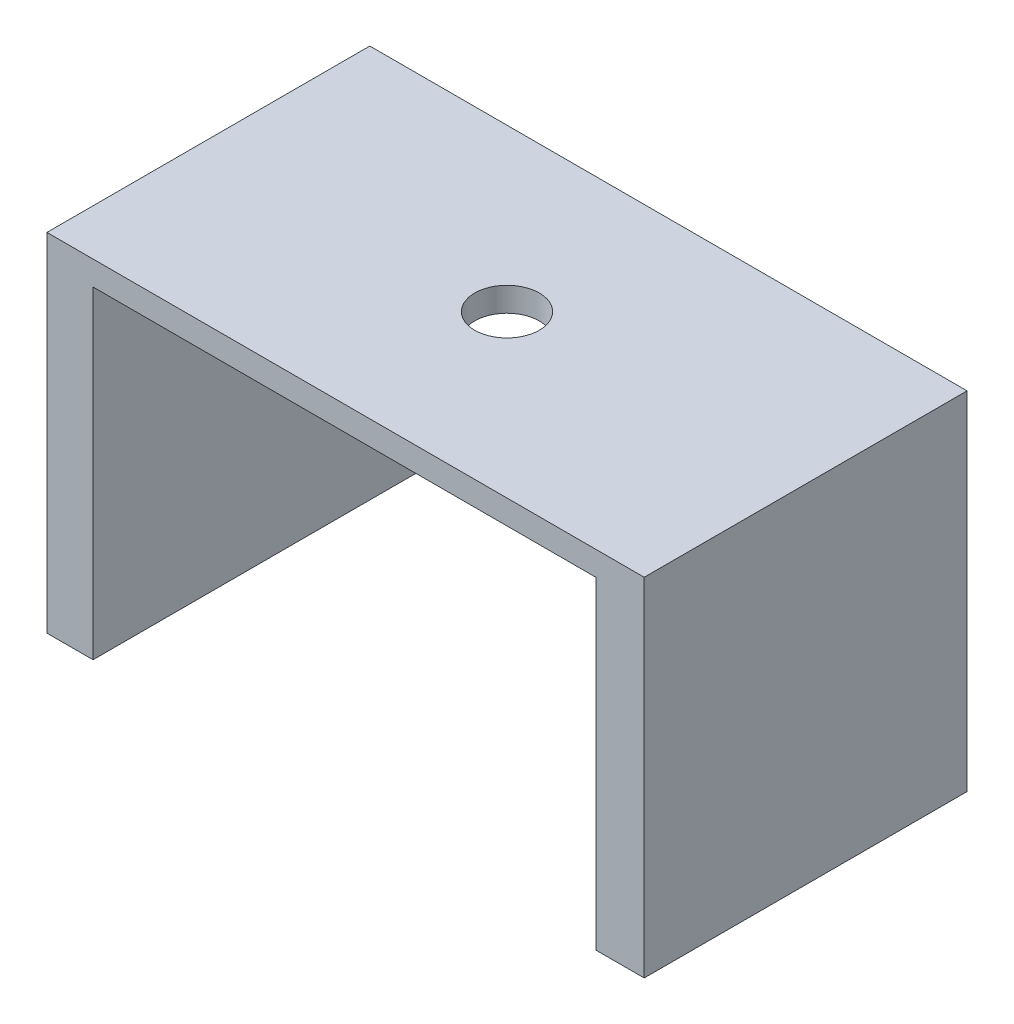
ISO-10303-21;
HEADER;
FILE_DESCRIPTION(('STEP AP214'),'2;1');
FILE_NAME('part.step','',(''),(''),'','','');
FILE_SCHEMA(('AUTOMOTIVE_DESIGN { 1 0 10303 214 1 1 1 1 }'));
ENDSEC;
DATA;
#1=APPLICATION_CONTEXT('core data for automotive mechanical design processes');
#2=APPLICATION_PROTOCOL_DEFINITION('international standard','automotive_design',2000,#1);
#3=PRODUCT_CONTEXT('',#1,'mechanical');
#4=PRODUCT('Part','Part','',(#3));
#5=PRODUCT_RELATED_PRODUCT_CATEGORY('part','',(#4));
#6=PRODUCT_DEFINITION_FORMATION('','',#4);
#7=PRODUCT_DEFINITION_CONTEXT('part definition',#1,'design');
#8=PRODUCT_DEFINITION('design','',#6,#7);
#9=PRODUCT_DEFINITION_SHAPE('','',#8);
#10=(LENGTH_UNIT() NAMED_UNIT(*) SI_UNIT(.MILLI.,.METRE.));
#11=(NAMED_UNIT(*) PLANE_ANGLE_UNIT() SI_UNIT($,.RADIAN.));
#12=(NAMED_UNIT(*) SI_UNIT($,.STERADIAN.) SOLID_ANGLE_UNIT());
#13=UNCERTAINTY_MEASURE_WITH_UNIT(LENGTH_MEASURE(1.E-05),#10,'distance_accuracy_value','');
#14=(GEOMETRIC_REPRESENTATION_CONTEXT(3) GLOBAL_UNCERTAINTY_ASSIGNED_CONTEXT((#13)) GLOBAL_UNIT_ASSIGNED_CONTEXT((#10,
#11,#12)) REPRESENTATION_CONTEXT('',''));
#15=CARTESIAN_POINT('',(0.,0.,0.));
#16=DIRECTION('',(0.,0.,1.));
#17=DIRECTION('',(1.,0.,0.));
#18=AXIS2_PLACEMENT_3D('',#15,#16,#17);
#19=CARTESIAN_POINT('',(0.,0.,0.));
#20=DIRECTION('',(0.,1.,0.));
#21=DIRECTION('',(0.,0.,1.));
#22=AXIS2_PLACEMENT_3D('',#19,#20,#21);
#23=PLANE('',#22);
#24=CARTESIAN_POINT('',(0.,0.,0.));
#25=DIRECTION('',(0.,1.,0.));
#26=DIRECTION('',(0.,0.,1.));
#27=AXIS2_PLACEMENT_3D('',#24,#25,#26);
#28=CIRCLE('',#27,20.);
#29=CARTESIAN_POINT('',(0.,0.,20.));
#30=VERTEX_POINT('',#29);
#31=EDGE_CURVE('E138',#30,#30,#28,.T.);
#32=ORIENTED_EDGE('',*,*,#31,.T.);
#33=EDGE_LOOP('',(#32));
#34=FACE_BOUND('',#33,.T.);
#35=DIRECTION('',(0.,0.,1.));
#36=VECTOR('',#35,1.);
#37=CARTESIAN_POINT('',(-156.43830766609,0.,100.));
#38=LINE('',#37,#36);
#39=CARTESIAN_POINT('',(-156.43830766609,0.,-100.));
#40=VERTEX_POINT('',#39);
#41=CARTESIAN_POINT('',(-156.43830766609,0.,100.));
#42=VERTEX_POINT('',#41);
#43=EDGE_CURVE('E61',#40,#42,#38,.T.);
#44=ORIENTED_EDGE('',*,*,#43,.F.);
#45=DIRECTION('',(-1.,0.,0.));
#46=VECTOR('',#45,1.);
#47=CARTESIAN_POINT('',(-185.,0.,-100.));
#48=LINE('',#47,#46);
#49=CARTESIAN_POINT('',(155.,0.,-100.));
#50=VERTEX_POINT('',#49);
#51=EDGE_CURVE('E151',#50,#40,#48,.T.);
#52=ORIENTED_EDGE('',*,*,#51,.F.);
#53=DIRECTION('',(0.,0.,-1.));
#54=VECTOR('',#53,1.);
#55=CARTESIAN_POINT('',(155.,0.,100.));
#56=LINE('',#55,#54);
#57=CARTESIAN_POINT('',(155.,0.,100.));
#58=VERTEX_POINT('',#57);
#59=EDGE_CURVE('E66',#58,#50,#56,.T.);
#60=ORIENTED_EDGE('',*,*,#59,.F.);
#61=DIRECTION('',(1.,0.,0.));
#62=VECTOR('',#61,1.);
#63=CARTESIAN_POINT('',(-185.,0.,100.));
#64=LINE('',#63,#62);
#65=EDGE_CURVE('E181',#42,#58,#64,.T.);
#66=ORIENTED_EDGE('',*,*,#65,.F.);
#67=EDGE_LOOP('',(#44,#52,#60,#66));
#68=FACE_BOUND('',#67,.T.);
#69=ADVANCED_FACE('F45',(#34,#68),#23,.F.);
#70=CARTESIAN_POINT('',(185.,15.,-100.));
#71=DIRECTION('',(-1.,0.,0.));
#72=DIRECTION('',(0.,0.,1.));
#73=AXIS2_PLACEMENT_3D('',#70,#71,#72);
#74=PLANE('',#73);
#75=DIRECTION('',(0.,-1.,0.));
#76=VECTOR('',#75,1.);
#77=CARTESIAN_POINT('',(185.,15.,100.));
#78=LINE('',#77,#76);
#79=CARTESIAN_POINT('',(185.,15.,100.));
#80=VERTEX_POINT('',#79);
#81=CARTESIAN_POINT('',(185.,-200.,100.));
#82=VERTEX_POINT('',#81);
#83=EDGE_CURVE('E189',#80,#82,#78,.T.);
#84=ORIENTED_EDGE('',*,*,#83,.T.);
#85=DIRECTION('',(0.,0.,1.));
#86=VECTOR('',#85,1.);
#87=CARTESIAN_POINT('',(185.,-200.,100.));
#88=LINE('',#87,#86);
#89=CARTESIAN_POINT('',(185.,-200.,-100.));
#90=VERTEX_POINT('',#89);
#91=EDGE_CURVE('E163',#90,#82,#88,.T.);
#92=ORIENTED_EDGE('',*,*,#91,.F.);
#93=DIRECTION('',(0.,-1.,0.));
#94=VECTOR('',#93,1.);
#95=CARTESIAN_POINT('',(185.,15.,-100.));
#96=LINE('',#95,#94);
#97=CARTESIAN_POINT('',(185.,15.,-100.));
#98=VERTEX_POINT('',#97);
#99=EDGE_CURVE('E11',#98,#90,#96,.T.);
#100=ORIENTED_EDGE('',*,*,#99,.F.);
#101=DIRECTION('',(0.,0.,-1.));
#102=VECTOR('',#101,1.);
#103=CARTESIAN_POINT('',(185.,15.,-100.));
#104=LINE('',#103,#102);
#105=EDGE_CURVE('E176',#80,#98,#104,.T.);
#106=ORIENTED_EDGE('',*,*,#105,.F.);
#107=EDGE_LOOP('',(#84,#92,#100,#106));
#108=FACE_BOUND('',#107,.T.);
#109=ADVANCED_FACE('F47',(#108),#74,.F.);
#110=CARTESIAN_POINT('',(-185.,15.,-100.));
#111=DIRECTION('',(0.,0.,1.));
#112=DIRECTION('',(1.,0.,0.));
#113=AXIS2_PLACEMENT_3D('',#110,#111,#112);
#114=PLANE('',#113);
#115=ORIENTED_EDGE('',*,*,#99,.T.);
#116=DIRECTION('',(1.,0.,0.));
#117=VECTOR('',#116,1.);
#118=CARTESIAN_POINT('',(185.,-200.,-100.));
#119=LINE('',#118,#117);
#120=CARTESIAN_POINT('',(155.,-200.,-100.));
#121=VERTEX_POINT('',#120);
#122=EDGE_CURVE('E160',#121,#90,#119,.T.);
#123=ORIENTED_EDGE('',*,*,#122,.F.);
#124=DIRECTION('',(0.,1.,0.));
#125=VECTOR('',#124,1.);
#126=CARTESIAN_POINT('',(155.,-200.,-100.));
#127=LINE('',#126,#125);
#128=EDGE_CURVE('E156',#121,#50,#127,.T.);
#129=ORIENTED_EDGE('',*,*,#128,.T.);
#130=ORIENTED_EDGE('',*,*,#51,.T.);
#131=DIRECTION('',(0.,1.,0.));
#132=VECTOR('',#131,1.);
#133=CARTESIAN_POINT('',(-156.43830766609,-200.,-100.));
#134=LINE('',#133,#132);
#135=CARTESIAN_POINT('',(-156.43830766609,-200.,-100.));
#136=VERTEX_POINT('',#135);
#137=EDGE_CURVE('E123',#136,#40,#134,.T.);
#138=ORIENTED_EDGE('',*,*,#137,.F.);
#139=DIRECTION('',(1.,0.,0.));
#140=VECTOR('',#139,1.);
#141=CARTESIAN_POINT('',(-185.,-200.,-100.));
#142=LINE('',#141,#140);
#143=CARTESIAN_POINT('',(-185.,-200.,-100.));
#144=VERTEX_POINT('',#143);
#145=EDGE_CURVE('E120',#144,#136,#142,.T.);
#146=ORIENTED_EDGE('',*,*,#145,.F.);
#147=DIRECTION('',(0.,-1.,0.));
#148=VECTOR('',#147,1.);
#149=CARTESIAN_POINT('',(-185.,15.,-100.));
#150=LINE('',#149,#148);
#151=CARTESIAN_POINT('',(-185.,15.,-100.));
#152=VERTEX_POINT('',#151);
#153=EDGE_CURVE('E54',#152,#144,#150,.T.);
#154=ORIENTED_EDGE('',*,*,#153,.F.);
#155=DIRECTION('',(-1.,0.,0.));
#156=VECTOR('',#155,1.);
#157=CARTESIAN_POINT('',(-185.,15.,-100.));
#158=LINE('',#157,#156);
#159=EDGE_CURVE('E180',#98,#152,#158,.T.);
#160=ORIENTED_EDGE('',*,*,#159,.F.);
#161=EDGE_LOOP('',(#115,#123,#129,#130,#138,#146,#154,#160));
#162=FACE_BOUND('',#161,.T.);
#163=ADVANCED_FACE('F121',(#162),#114,.F.);
#164=CARTESIAN_POINT('',(-185.,15.,-100.));
#165=DIRECTION('',(1.,0.,0.));
#166=DIRECTION('',(0.,0.,-1.));
#167=AXIS2_PLACEMENT_3D('',#164,#165,#166);
#168=PLANE('',#167);
#169=ORIENTED_EDGE('',*,*,#153,.T.);
#170=DIRECTION('',(0.,0.,-1.));
#171=VECTOR('',#170,1.);
#172=CARTESIAN_POINT('',(-185.,-200.,100.));
#173=LINE('',#172,#171);
#174=CARTESIAN_POINT('',(-185.,-200.,100.));
#175=VERTEX_POINT('',#174);
#176=EDGE_CURVE('E114',#175,#144,#173,.T.);
#177=ORIENTED_EDGE('',*,*,#176,.F.);
#178=DIRECTION('',(0.,-1.,0.));
#179=VECTOR('',#178,1.);
#180=CARTESIAN_POINT('',(-185.,15.,100.));
#181=LINE('',#180,#179);
#182=CARTESIAN_POINT('',(-185.,15.,100.));
#183=VERTEX_POINT('',#182);
#184=EDGE_CURVE('E118',#183,#175,#181,.T.);
#185=ORIENTED_EDGE('',*,*,#184,.F.);
#186=DIRECTION('',(0.,0.,1.));
#187=VECTOR('',#186,1.);
#188=CARTESIAN_POINT('',(-185.,15.,-100.));
#189=LINE('',#188,#187);
#190=EDGE_CURVE('E115',#152,#183,#189,.T.);
#191=ORIENTED_EDGE('',*,*,#190,.F.);
#192=EDGE_LOOP('',(#169,#177,#185,#191));
#193=FACE_BOUND('',#192,.T.);
#194=ADVANCED_FACE('F111',(#193),#168,.F.);
#195=CARTESIAN_POINT('',(-185.,15.,100.));
#196=DIRECTION('',(0.,0.,-1.));
#197=DIRECTION('',(-1.,0.,0.));
#198=AXIS2_PLACEMENT_3D('',#195,#196,#197);
#199=PLANE('',#198);
#200=ORIENTED_EDGE('',*,*,#184,.T.);
#201=DIRECTION('',(-1.,0.,0.));
#202=VECTOR('',#201,1.);
#203=CARTESIAN_POINT('',(-185.,-200.,100.));
#204=LINE('',#203,#202);
#205=CARTESIAN_POINT('',(-156.43830766609,-200.,100.));
#206=VERTEX_POINT('',#205);
#207=EDGE_CURVE('E132',#206,#175,#204,.T.);
#208=ORIENTED_EDGE('',*,*,#207,.F.);
#209=DIRECTION('',(0.,1.,0.));
#210=VECTOR('',#209,1.);
#211=CARTESIAN_POINT('',(-156.43830766609,-200.,100.));
#212=LINE('',#211,#210);
#213=EDGE_CURVE('E144',#206,#42,#212,.T.);
#214=ORIENTED_EDGE('',*,*,#213,.T.);
#215=ORIENTED_EDGE('',*,*,#65,.T.);
#216=DIRECTION('',(0.,1.,0.));
#217=VECTOR('',#216,1.);
#218=CARTESIAN_POINT('',(155.,-200.,100.));
#219=LINE('',#218,#217);
#220=CARTESIAN_POINT('',(155.,-200.,100.));
#221=VERTEX_POINT('',#220);
#222=EDGE_CURVE('E152',#221,#58,#219,.T.);
#223=ORIENTED_EDGE('',*,*,#222,.F.);
#224=DIRECTION('',(-1.,0.,0.));
#225=VECTOR('',#224,1.);
#226=CARTESIAN_POINT('',(185.,-200.,100.));
#227=LINE('',#226,#225);
#228=EDGE_CURVE('E170',#82,#221,#227,.T.);
#229=ORIENTED_EDGE('',*,*,#228,.F.);
#230=ORIENTED_EDGE('',*,*,#83,.F.);
#231=DIRECTION('',(1.,0.,0.));
#232=VECTOR('',#231,1.);
#233=CARTESIAN_POINT('',(-185.,15.,100.));
#234=LINE('',#233,#232);
#235=EDGE_CURVE('E186',#183,#80,#234,.T.);
#236=ORIENTED_EDGE('',*,*,#235,.F.);
#237=EDGE_LOOP('',(#200,#208,#214,#215,#223,#229,#230,#236));
#238=FACE_BOUND('',#237,.T.);
#239=ADVANCED_FACE('F199',(#238),#199,.F.);
#240=CARTESIAN_POINT('',(0.,15.,0.));
#241=DIRECTION('',(0.,1.,0.));
#242=DIRECTION('',(0.,0.,1.));
#243=AXIS2_PLACEMENT_3D('',#240,#241,#242);
#244=PLANE('',#243);
#245=CARTESIAN_POINT('',(0.,15.,0.));
#246=DIRECTION('',(0.,1.,0.));
#247=DIRECTION('',(0.,0.,1.));
#248=AXIS2_PLACEMENT_3D('',#245,#246,#247);
#249=CIRCLE('',#248,20.);
#250=CARTESIAN_POINT('',(0.,15.,20.));
#251=VERTEX_POINT('',#250);
#252=EDGE_CURVE('E330',#251,#251,#249,.T.);
#253=ORIENTED_EDGE('',*,*,#252,.F.);
#254=EDGE_LOOP('',(#253));
#255=FACE_BOUND('',#254,.T.);
#256=ORIENTED_EDGE('',*,*,#105,.T.);
#257=ORIENTED_EDGE('',*,*,#159,.T.);
#258=ORIENTED_EDGE('',*,*,#190,.T.);
#259=ORIENTED_EDGE('',*,*,#235,.T.);
#260=EDGE_LOOP('',(#256,#257,#258,#259));
#261=FACE_BOUND('',#260,.T.);
#262=ADVANCED_FACE('F204',(#255,#261),#244,.T.);
#263=CARTESIAN_POINT('',(155.,-200.,100.));
#264=DIRECTION('',(1.,0.,0.));
#265=DIRECTION('',(0.,0.,-1.));
#266=AXIS2_PLACEMENT_3D('',#263,#264,#265);
#267=PLANE('',#266);
#268=ORIENTED_EDGE('',*,*,#59,.T.);
#269=ORIENTED_EDGE('',*,*,#128,.F.);
#270=DIRECTION('',(0.,0.,-1.));
#271=VECTOR('',#270,1.);
#272=CARTESIAN_POINT('',(155.,-200.,100.));
#273=LINE('',#272,#271);
#274=EDGE_CURVE('E167',#221,#121,#273,.T.);
#275=ORIENTED_EDGE('',*,*,#274,.F.);
#276=ORIENTED_EDGE('',*,*,#222,.T.);
#277=EDGE_LOOP('',(#268,#269,#275,#276));
#278=FACE_BOUND('',#277,.T.);
#279=ADVANCED_FACE('F215',(#278),#267,.F.);
#280=CARTESIAN_POINT('',(0.,-200.,0.));
#281=DIRECTION('',(0.,1.,0.));
#282=DIRECTION('',(0.,0.,1.));
#283=AXIS2_PLACEMENT_3D('',#280,#281,#282);
#284=PLANE('',#283);
#285=ORIENTED_EDGE('',*,*,#91,.T.);
#286=ORIENTED_EDGE('',*,*,#228,.T.);
#287=ORIENTED_EDGE('',*,*,#274,.T.);
#288=ORIENTED_EDGE('',*,*,#122,.T.);
#289=EDGE_LOOP('',(#285,#286,#287,#288));
#290=FACE_BOUND('',#289,.T.);
#291=ADVANCED_FACE('F210',(#290),#284,.F.);
#292=CARTESIAN_POINT('',(-156.43830766609,-200.,100.));
#293=DIRECTION('',(-1.,0.,0.));
#294=DIRECTION('',(0.,0.,1.));
#295=AXIS2_PLACEMENT_3D('',#292,#293,#294);
#296=PLANE('',#295);
#297=ORIENTED_EDGE('',*,*,#43,.T.);
#298=ORIENTED_EDGE('',*,*,#213,.F.);
#299=DIRECTION('',(0.,0.,1.));
#300=VECTOR('',#299,1.);
#301=CARTESIAN_POINT('',(-156.43830766609,-200.,100.));
#302=LINE('',#301,#300);
#303=EDGE_CURVE('E127',#136,#206,#302,.T.);
#304=ORIENTED_EDGE('',*,*,#303,.F.);
#305=ORIENTED_EDGE('',*,*,#137,.T.);
#306=EDGE_LOOP('',(#297,#298,#304,#305));
#307=FACE_BOUND('',#306,.T.);
#308=ADVANCED_FACE('F217',(#307),#296,.F.);
#309=CARTESIAN_POINT('',(0.,-200.,0.));
#310=DIRECTION('',(0.,-1.,0.));
#311=DIRECTION('',(0.,0.,-1.));
#312=AXIS2_PLACEMENT_3D('',#309,#310,#311);
#313=PLANE('',#312);
#314=ORIENTED_EDGE('',*,*,#176,.T.);
#315=ORIENTED_EDGE('',*,*,#145,.T.);
#316=ORIENTED_EDGE('',*,*,#303,.T.);
#317=ORIENTED_EDGE('',*,*,#207,.T.);
#318=EDGE_LOOP('',(#314,#315,#316,#317));
#319=FACE_BOUND('',#318,.T.);
#320=ADVANCED_FACE('F130',(#319),#313,.T.);
#321=CARTESIAN_POINT('',(0.,-185.,0.));
#322=DIRECTION('',(0.,1.,0.));
#323=DIRECTION('',(0.,0.,1.));
#324=AXIS2_PLACEMENT_3D('',#321,#322,#323);
#325=CYLINDRICAL_SURFACE('',#324,20.);
#326=ORIENTED_EDGE('',*,*,#252,.T.);
#327=EDGE_LOOP('',(#326));
#328=FACE_BOUND('',#327,.T.);
#329=ORIENTED_EDGE('',*,*,#31,.F.);
#330=EDGE_LOOP('',(#329));
#331=FACE_BOUND('',#330,.T.);
#332=ADVANCED_FACE('F225',(#328,#331),#325,.F.);
#333=CLOSED_SHELL('',(#69,#109,#163,#194,#239,#262,#279,#291,#308,#320,#332));
#334=MANIFOLD_SOLID_BREP('B2',#333);
#335=ADVANCED_BREP_SHAPE_REPRESENTATION('',(#18,#334),#14);
#336=SHAPE_DEFINITION_REPRESENTATION(#9,#335);
ENDSEC;
END-ISO-10303-21;
